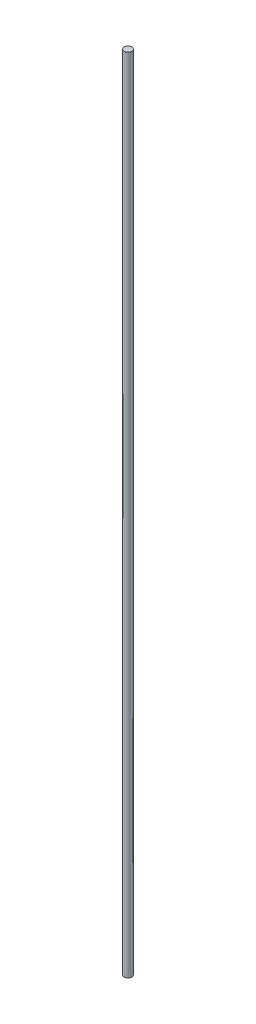
ISO-10303-21;
HEADER;
FILE_DESCRIPTION(('STEP AP214'),'2;1');
FILE_NAME('part.step','',(''),(''),'','','');
FILE_SCHEMA(('AUTOMOTIVE_DESIGN { 1 0 10303 214 1 1 1 1 }'));
ENDSEC;
DATA;
#1=APPLICATION_CONTEXT('core data for automotive mechanical design processes');
#2=APPLICATION_PROTOCOL_DEFINITION('international standard','automotive_design',2000,#1);
#3=PRODUCT_CONTEXT('',#1,'mechanical');
#4=PRODUCT('Part','Part','',(#3));
#5=PRODUCT_RELATED_PRODUCT_CATEGORY('part','',(#4));
#6=PRODUCT_DEFINITION_FORMATION('','',#4);
#7=PRODUCT_DEFINITION_CONTEXT('part definition',#1,'design');
#8=PRODUCT_DEFINITION('design','',#6,#7);
#9=PRODUCT_DEFINITION_SHAPE('','',#8);
#10=(LENGTH_UNIT() NAMED_UNIT(*) SI_UNIT(.MILLI.,.METRE.));
#11=(NAMED_UNIT(*) PLANE_ANGLE_UNIT() SI_UNIT($,.RADIAN.));
#12=(NAMED_UNIT(*) SI_UNIT($,.STERADIAN.) SOLID_ANGLE_UNIT());
#13=UNCERTAINTY_MEASURE_WITH_UNIT(LENGTH_MEASURE(1.E-05),#10,'distance_accuracy_value','');
#14=(GEOMETRIC_REPRESENTATION_CONTEXT(3) GLOBAL_UNCERTAINTY_ASSIGNED_CONTEXT((#13)) GLOBAL_UNIT_ASSIGNED_CONTEXT((#10,
#11,#12)) REPRESENTATION_CONTEXT('',''));
#15=CARTESIAN_POINT('',(0.,0.,0.));
#16=DIRECTION('',(0.,0.,1.));
#17=DIRECTION('',(1.,0.,0.));
#18=AXIS2_PLACEMENT_3D('',#15,#16,#17);
#19=CARTESIAN_POINT('',(0.,500.,0.));
#20=DIRECTION('',(0.,-1.,0.));
#21=DIRECTION('',(0.,0.,-1.));
#22=AXIS2_PLACEMENT_3D('',#19,#20,#21);
#23=CYLINDRICAL_SURFACE('',#22,4.7625);
#24=CARTESIAN_POINT('',(0.,500.,0.));
#25=DIRECTION('',(0.,1.,0.));
#26=DIRECTION('',(0.,0.,1.));
#27=AXIS2_PLACEMENT_3D('',#24,#25,#26);
#28=CIRCLE('',#27,4.7625);
#29=CARTESIAN_POINT('',(0.,500.,4.7625));
#30=VERTEX_POINT('',#29);
#31=EDGE_CURVE('E10',#30,#30,#28,.T.);
#32=ORIENTED_EDGE('',*,*,#31,.F.);
#33=EDGE_LOOP('',(#32));
#34=FACE_BOUND('',#33,.T.);
#35=CARTESIAN_POINT('',(0.,-500.,0.));
#36=DIRECTION('',(0.,1.,0.));
#37=DIRECTION('',(0.,0.,1.));
#38=AXIS2_PLACEMENT_3D('',#35,#36,#37);
#39=CIRCLE('',#38,4.7625);
#40=CARTESIAN_POINT('',(0.,-500.,4.7625));
#41=VERTEX_POINT('',#40);
#42=EDGE_CURVE('E40',#41,#41,#39,.T.);
#43=ORIENTED_EDGE('',*,*,#42,.T.);
#44=EDGE_LOOP('',(#43));
#45=FACE_BOUND('',#44,.T.);
#46=ADVANCED_FACE('F37',(#34,#45),#23,.T.);
#47=CARTESIAN_POINT('',(0.,500.,0.));
#48=DIRECTION('',(0.,1.,0.));
#49=DIRECTION('',(0.,0.,1.));
#50=AXIS2_PLACEMENT_3D('',#47,#48,#49);
#51=PLANE('',#50);
#52=ORIENTED_EDGE('',*,*,#31,.T.);
#53=EDGE_LOOP('',(#52));
#54=FACE_BOUND('',#53,.T.);
#55=ADVANCED_FACE('F52',(#54),#51,.T.);
#56=CARTESIAN_POINT('',(0.,-500.,0.));
#57=DIRECTION('',(0.,1.,0.));
#58=DIRECTION('',(0.,0.,1.));
#59=AXIS2_PLACEMENT_3D('',#56,#57,#58);
#60=PLANE('',#59);
#61=ORIENTED_EDGE('',*,*,#42,.F.);
#62=EDGE_LOOP('',(#61));
#63=FACE_BOUND('',#62,.T.);
#64=ADVANCED_FACE('F50',(#63),#60,.F.);
#65=CLOSED_SHELL('',(#46,#55,#64));
#66=MANIFOLD_SOLID_BREP('B2',#65);
#67=ADVANCED_BREP_SHAPE_REPRESENTATION('',(#18,#66),#14);
#68=SHAPE_DEFINITION_REPRESENTATION(#9,#67);
ENDSEC;
END-ISO-10303-21;
